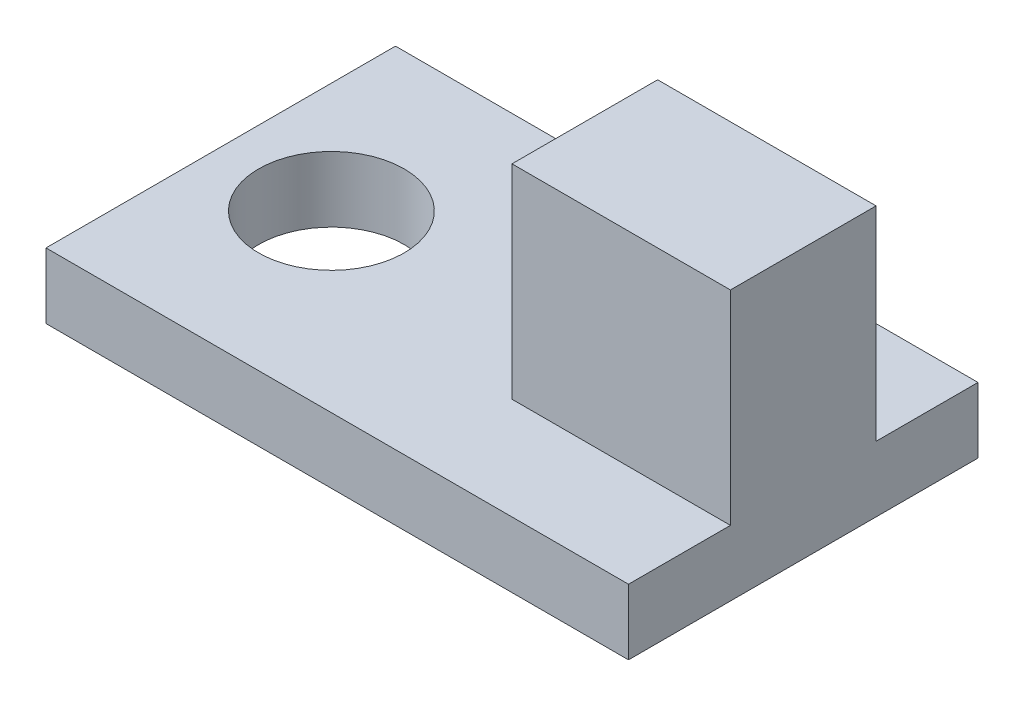
ISO-10303-21;
HEADER;
FILE_DESCRIPTION(('STEP AP214'),'2;1');
FILE_NAME('part.step','',(''),(''),'','','');
FILE_SCHEMA(('AUTOMOTIVE_DESIGN { 1 0 10303 214 1 1 1 1 }'));
ENDSEC;
DATA;
#1=APPLICATION_CONTEXT('core data for automotive mechanical design processes');
#2=APPLICATION_PROTOCOL_DEFINITION('international standard','automotive_design',2000,#1);
#3=PRODUCT_CONTEXT('',#1,'mechanical');
#4=PRODUCT('Part','Part','',(#3));
#5=PRODUCT_RELATED_PRODUCT_CATEGORY('part','',(#4));
#6=PRODUCT_DEFINITION_FORMATION('','',#4);
#7=PRODUCT_DEFINITION_CONTEXT('part definition',#1,'design');
#8=PRODUCT_DEFINITION('design','',#6,#7);
#9=PRODUCT_DEFINITION_SHAPE('','',#8);
#10=(LENGTH_UNIT() NAMED_UNIT(*) SI_UNIT(.MILLI.,.METRE.));
#11=(NAMED_UNIT(*) PLANE_ANGLE_UNIT() SI_UNIT($,.RADIAN.));
#12=(NAMED_UNIT(*) SI_UNIT($,.STERADIAN.) SOLID_ANGLE_UNIT());
#13=UNCERTAINTY_MEASURE_WITH_UNIT(LENGTH_MEASURE(1.E-05),#10,'distance_accuracy_value','');
#14=(GEOMETRIC_REPRESENTATION_CONTEXT(3) GLOBAL_UNCERTAINTY_ASSIGNED_CONTEXT((#13)) GLOBAL_UNIT_ASSIGNED_CONTEXT((#10,
#11,#12)) REPRESENTATION_CONTEXT('',''));
#15=CARTESIAN_POINT('',(0.,0.,0.));
#16=DIRECTION('',(0.,0.,1.));
#17=DIRECTION('',(1.,0.,0.));
#18=AXIS2_PLACEMENT_3D('',#15,#16,#17);
#19=CARTESIAN_POINT('',(56.1594146862626,-10.,14.989335089922));
#20=DIRECTION('',(0.,-1.,0.));
#21=DIRECTION('',(0.,0.,-1.));
#22=AXIS2_PLACEMENT_3D('',#19,#20,#21);
#23=PLANE('',#22);
#24=CARTESIAN_POINT('',(104.958650544286,-10.,14.989335089922));
#25=DIRECTION('',(0.,-1.,0.));
#26=DIRECTION('',(0.,0.,-1.));
#27=AXIS2_PLACEMENT_3D('',#24,#25,#26);
#28=CIRCLE('',#27,5.);
#29=CARTESIAN_POINT('',(104.958650544286,-10.,9.98933508992196));
#30=VERTEX_POINT('',#29);
#31=EDGE_CURVE('E11',#30,#30,#28,.T.);
#32=ORIENTED_EDGE('',*,*,#31,.T.);
#33=EDGE_LOOP('',(#32));
#34=FACE_BOUND('',#33,.T.);
#35=DIRECTION('',(1.,0.,0.));
#36=VECTOR('',#35,1.);
#37=CARTESIAN_POINT('',(137.360178828239,-10.,19.9893350899219));
#38=LINE('',#37,#36);
#39=CARTESIAN_POINT('',(122.360178828239,-10.,19.9893350899219));
#40=VERTEX_POINT('',#39);
#41=CARTESIAN_POINT('',(137.360178828239,-10.,19.9893350899219));
#42=VERTEX_POINT('',#41);
#43=EDGE_CURVE('E53',#40,#42,#38,.T.);
#44=ORIENTED_EDGE('',*,*,#43,.F.);
#45=DIRECTION('',(0.,0.,1.));
#46=VECTOR('',#45,1.);
#47=CARTESIAN_POINT('',(122.360178828239,-10.,9.98933508992193));
#48=LINE('',#47,#46);
#49=CARTESIAN_POINT('',(122.360178828239,-10.,9.98933508992193));
#50=VERTEX_POINT('',#49);
#51=EDGE_CURVE('E183',#50,#40,#48,.T.);
#52=ORIENTED_EDGE('',*,*,#51,.F.);
#53=DIRECTION('',(-1.,0.,0.));
#54=VECTOR('',#53,1.);
#55=CARTESIAN_POINT('',(137.360178828239,-10.,9.98933508992193));
#56=LINE('',#55,#54);
#57=CARTESIAN_POINT('',(137.360178828239,-10.,9.98933508992193));
#58=VERTEX_POINT('',#57);
#59=EDGE_CURVE('E59',#58,#50,#56,.T.);
#60=ORIENTED_EDGE('',*,*,#59,.F.);
#61=DIRECTION('',(0.,0.,-1.));
#62=VECTOR('',#61,1.);
#63=CARTESIAN_POINT('',(137.360178828239,-10.,14.989335089922));
#64=LINE('',#63,#62);
#65=CARTESIAN_POINT('',(137.360178828239,-10.,2.98933508992196));
#66=VERTEX_POINT('',#65);
#67=EDGE_CURVE('E129',#58,#66,#64,.T.);
#68=ORIENTED_EDGE('',*,*,#67,.T.);
#69=DIRECTION('',(1.,0.,0.));
#70=VECTOR('',#69,1.);
#71=CARTESIAN_POINT('',(97.3601788282394,-10.,2.98933508992196));
#72=LINE('',#71,#70);
#73=CARTESIAN_POINT('',(97.3601788282394,-10.,2.98933508992196));
#74=VERTEX_POINT('',#73);
#75=EDGE_CURVE('E150',#74,#66,#72,.T.);
#76=ORIENTED_EDGE('',*,*,#75,.F.);
#77=DIRECTION('',(0.,0.,-1.));
#78=VECTOR('',#77,1.);
#79=CARTESIAN_POINT('',(97.3601788282394,-10.,14.989335089922));
#80=LINE('',#79,#78);
#81=CARTESIAN_POINT('',(97.3601788282394,-10.,26.9893350899219));
#82=VERTEX_POINT('',#81);
#83=EDGE_CURVE('E40',#82,#74,#80,.T.);
#84=ORIENTED_EDGE('',*,*,#83,.F.);
#85=DIRECTION('',(-1.,0.,0.));
#86=VECTOR('',#85,1.);
#87=CARTESIAN_POINT('',(137.360178828239,-10.,26.9893350899219));
#88=LINE('',#87,#86);
#89=CARTESIAN_POINT('',(137.360178828239,-10.,26.9893350899219));
#90=VERTEX_POINT('',#89);
#91=EDGE_CURVE('E133',#90,#82,#88,.T.);
#92=ORIENTED_EDGE('',*,*,#91,.F.);
#93=EDGE_CURVE('E163',#90,#42,#64,.T.);
#94=ORIENTED_EDGE('',*,*,#93,.T.);
#95=EDGE_LOOP('',(#44,#52,#60,#68,#76,#84,#92,#94));
#96=FACE_BOUND('',#95,.T.);
#97=ADVANCED_FACE('F36',(#34,#96),#23,.F.);
#98=CARTESIAN_POINT('',(56.1594146862626,-14.5,14.989335089922));
#99=DIRECTION('',(0.,-1.,0.));
#100=DIRECTION('',(0.,0.,-1.));
#101=AXIS2_PLACEMENT_3D('',#98,#99,#100);
#102=PLANE('',#101);
#103=CARTESIAN_POINT('',(104.958650544286,-14.5,14.989335089922));
#104=DIRECTION('',(0.,-1.,0.));
#105=DIRECTION('',(0.,0.,-1.));
#106=AXIS2_PLACEMENT_3D('',#103,#104,#105);
#107=CIRCLE('',#106,5.);
#108=CARTESIAN_POINT('',(104.958650544286,-14.5,9.98933508992196));
#109=VERTEX_POINT('',#108);
#110=EDGE_CURVE('E45',#109,#109,#107,.T.);
#111=ORIENTED_EDGE('',*,*,#110,.F.);
#112=EDGE_LOOP('',(#111));
#113=FACE_BOUND('',#112,.T.);
#114=DIRECTION('',(0.,0.,-1.));
#115=VECTOR('',#114,1.);
#116=CARTESIAN_POINT('',(137.360178828239,-14.5,14.989335089922));
#117=LINE('',#116,#115);
#118=CARTESIAN_POINT('',(137.360178828239,-14.5,26.9893350899219));
#119=VERTEX_POINT('',#118);
#120=CARTESIAN_POINT('',(137.360178828239,-14.5,2.98933508992196));
#121=VERTEX_POINT('',#120);
#122=EDGE_CURVE('E162',#119,#121,#117,.T.);
#123=ORIENTED_EDGE('',*,*,#122,.F.);
#124=DIRECTION('',(1.,0.,0.));
#125=VECTOR('',#124,1.);
#126=CARTESIAN_POINT('',(97.3601788282394,-14.5,26.9893350899219));
#127=LINE('',#126,#125);
#128=CARTESIAN_POINT('',(97.3601788282394,-14.5,26.9893350899219));
#129=VERTEX_POINT('',#128);
#130=EDGE_CURVE('E144',#129,#119,#127,.T.);
#131=ORIENTED_EDGE('',*,*,#130,.F.);
#132=DIRECTION('',(0.,0.,-1.));
#133=VECTOR('',#132,1.);
#134=CARTESIAN_POINT('',(97.3601788282394,-14.5,14.989335089922));
#135=LINE('',#134,#133);
#136=CARTESIAN_POINT('',(97.3601788282394,-14.5,2.98933508992196));
#137=VERTEX_POINT('',#136);
#138=EDGE_CURVE('E159',#129,#137,#135,.T.);
#139=ORIENTED_EDGE('',*,*,#138,.T.);
#140=DIRECTION('',(-1.,0.,0.));
#141=VECTOR('',#140,1.);
#142=CARTESIAN_POINT('',(137.360178828239,-14.5,2.98933508992196));
#143=LINE('',#142,#141);
#144=EDGE_CURVE('E156',#121,#137,#143,.T.);
#145=ORIENTED_EDGE('',*,*,#144,.F.);
#146=EDGE_LOOP('',(#123,#131,#139,#145));
#147=FACE_BOUND('',#146,.T.);
#148=ADVANCED_FACE('F38',(#113,#147),#102,.T.);
#149=CARTESIAN_POINT('',(104.958650544286,-14.5,14.989335089922));
#150=DIRECTION('',(0.,1.,0.));
#151=DIRECTION('',(0.,0.,1.));
#152=AXIS2_PLACEMENT_3D('',#149,#150,#151);
#153=CYLINDRICAL_SURFACE('',#152,5.);
#154=ORIENTED_EDGE('',*,*,#31,.F.);
#155=EDGE_LOOP('',(#154));
#156=FACE_BOUND('',#155,.T.);
#157=ORIENTED_EDGE('',*,*,#110,.T.);
#158=EDGE_LOOP('',(#157));
#159=FACE_BOUND('',#158,.T.);
#160=ADVANCED_FACE('F206',(#156,#159),#153,.F.);
#161=CARTESIAN_POINT('',(137.360178828239,-14.5,14.989335089922));
#162=DIRECTION('',(1.,0.,0.));
#163=DIRECTION('',(0.,1.,0.));
#164=AXIS2_PLACEMENT_3D('',#161,#162,#163);
#165=PLANE('',#164);
#166=ORIENTED_EDGE('',*,*,#93,.F.);
#167=DIRECTION('',(0.,1.,0.));
#168=VECTOR('',#167,1.);
#169=CARTESIAN_POINT('',(137.360178828239,-14.5,26.9893350899219));
#170=LINE('',#169,#168);
#171=EDGE_CURVE('E130',#119,#90,#170,.T.);
#172=ORIENTED_EDGE('',*,*,#171,.F.);
#173=ORIENTED_EDGE('',*,*,#122,.T.);
#174=DIRECTION('',(0.,-1.,0.));
#175=VECTOR('',#174,1.);
#176=CARTESIAN_POINT('',(137.360178828239,-10.,2.98933508992196));
#177=LINE('',#176,#175);
#178=EDGE_CURVE('E153',#66,#121,#177,.T.);
#179=ORIENTED_EDGE('',*,*,#178,.F.);
#180=ORIENTED_EDGE('',*,*,#67,.F.);
#181=DIRECTION('',(0.,-1.,0.));
#182=VECTOR('',#181,1.);
#183=CARTESIAN_POINT('',(137.360178828239,4.,9.98933508992193));
#184=LINE('',#183,#182);
#185=CARTESIAN_POINT('',(137.360178828239,4.,9.98933508992193));
#186=VERTEX_POINT('',#185);
#187=EDGE_CURVE('E111',#186,#58,#184,.T.);
#188=ORIENTED_EDGE('',*,*,#187,.F.);
#189=DIRECTION('',(0.,0.,-1.));
#190=VECTOR('',#189,1.);
#191=CARTESIAN_POINT('',(137.360178828239,4.,9.98933508992193));
#192=LINE('',#191,#190);
#193=CARTESIAN_POINT('',(137.360178828239,4.,19.9893350899219));
#194=VERTEX_POINT('',#193);
#195=EDGE_CURVE('E117',#194,#186,#192,.T.);
#196=ORIENTED_EDGE('',*,*,#195,.F.);
#197=DIRECTION('',(0.,-1.,0.));
#198=VECTOR('',#197,1.);
#199=CARTESIAN_POINT('',(137.360178828239,4.,19.9893350899219));
#200=LINE('',#199,#198);
#201=EDGE_CURVE('E181',#194,#42,#200,.T.);
#202=ORIENTED_EDGE('',*,*,#201,.T.);
#203=EDGE_LOOP('',(#166,#172,#173,#179,#180,#188,#196,#202));
#204=FACE_BOUND('',#203,.T.);
#205=ADVANCED_FACE('F127',(#204),#165,.T.);
#206=CARTESIAN_POINT('',(97.3601788282394,-14.5,14.989335089922));
#207=DIRECTION('',(1.,0.,0.));
#208=DIRECTION('',(0.,1.,0.));
#209=AXIS2_PLACEMENT_3D('',#206,#207,#208);
#210=PLANE('',#209);
#211=ORIENTED_EDGE('',*,*,#83,.T.);
#212=DIRECTION('',(0.,1.,0.));
#213=VECTOR('',#212,1.);
#214=CARTESIAN_POINT('',(97.3601788282394,-14.5,2.98933508992196));
#215=LINE('',#214,#213);
#216=EDGE_CURVE('E147',#137,#74,#215,.T.);
#217=ORIENTED_EDGE('',*,*,#216,.F.);
#218=ORIENTED_EDGE('',*,*,#138,.F.);
#219=DIRECTION('',(0.,-1.,0.));
#220=VECTOR('',#219,1.);
#221=CARTESIAN_POINT('',(97.3601788282394,-10.,26.9893350899219));
#222=LINE('',#221,#220);
#223=EDGE_CURVE('E141',#82,#129,#222,.T.);
#224=ORIENTED_EDGE('',*,*,#223,.F.);
#225=EDGE_LOOP('',(#211,#217,#218,#224));
#226=FACE_BOUND('',#225,.T.);
#227=ADVANCED_FACE('F174',(#226),#210,.F.);
#228=CARTESIAN_POINT('',(0.,0.,2.98933508992196));
#229=DIRECTION('',(0.,0.,-1.));
#230=DIRECTION('',(-1.,0.,0.));
#231=AXIS2_PLACEMENT_3D('',#228,#229,#230);
#232=PLANE('',#231);
#233=ORIENTED_EDGE('',*,*,#216,.T.);
#234=ORIENTED_EDGE('',*,*,#75,.T.);
#235=ORIENTED_EDGE('',*,*,#178,.T.);
#236=ORIENTED_EDGE('',*,*,#144,.T.);
#237=EDGE_LOOP('',(#233,#234,#235,#236));
#238=FACE_BOUND('',#237,.T.);
#239=ADVANCED_FACE('F169',(#238),#232,.T.);
#240=CARTESIAN_POINT('',(0.,0.,26.9893350899219));
#241=DIRECTION('',(0.,0.,1.));
#242=DIRECTION('',(1.,0.,0.));
#243=AXIS2_PLACEMENT_3D('',#240,#241,#242);
#244=PLANE('',#243);
#245=ORIENTED_EDGE('',*,*,#171,.T.);
#246=ORIENTED_EDGE('',*,*,#91,.T.);
#247=ORIENTED_EDGE('',*,*,#223,.T.);
#248=ORIENTED_EDGE('',*,*,#130,.T.);
#249=EDGE_LOOP('',(#245,#246,#247,#248));
#250=FACE_BOUND('',#249,.T.);
#251=ADVANCED_FACE('F176',(#250),#244,.T.);
#252=CARTESIAN_POINT('',(137.360178828239,4.,9.98933508992193));
#253=DIRECTION('',(0.,0.,1.));
#254=DIRECTION('',(1.,0.,0.));
#255=AXIS2_PLACEMENT_3D('',#252,#253,#254);
#256=PLANE('',#255);
#257=ORIENTED_EDGE('',*,*,#59,.T.);
#258=DIRECTION('',(0.,-1.,0.));
#259=VECTOR('',#258,1.);
#260=CARTESIAN_POINT('',(122.360178828239,4.,9.98933508992193));
#261=LINE('',#260,#259);
#262=CARTESIAN_POINT('',(122.360178828239,4.,9.98933508992193));
#263=VERTEX_POINT('',#262);
#264=EDGE_CURVE('E113',#263,#50,#261,.T.);
#265=ORIENTED_EDGE('',*,*,#264,.F.);
#266=DIRECTION('',(-1.,0.,0.));
#267=VECTOR('',#266,1.);
#268=CARTESIAN_POINT('',(137.360178828239,4.,9.98933508992193));
#269=LINE('',#268,#267);
#270=EDGE_CURVE('E107',#186,#263,#269,.T.);
#271=ORIENTED_EDGE('',*,*,#270,.F.);
#272=ORIENTED_EDGE('',*,*,#187,.T.);
#273=EDGE_LOOP('',(#257,#265,#271,#272));
#274=FACE_BOUND('',#273,.T.);
#275=ADVANCED_FACE('F109',(#274),#256,.F.);
#276=CARTESIAN_POINT('',(122.360178828239,4.,9.98933508992193));
#277=DIRECTION('',(1.,0.,0.));
#278=DIRECTION('',(0.,0.,-1.));
#279=AXIS2_PLACEMENT_3D('',#276,#277,#278);
#280=PLANE('',#279);
#281=ORIENTED_EDGE('',*,*,#51,.T.);
#282=DIRECTION('',(0.,-1.,0.));
#283=VECTOR('',#282,1.);
#284=CARTESIAN_POINT('',(122.360178828239,4.,19.9893350899219));
#285=LINE('',#284,#283);
#286=CARTESIAN_POINT('',(122.360178828239,4.,19.9893350899219));
#287=VERTEX_POINT('',#286);
#288=EDGE_CURVE('E135',#287,#40,#285,.T.);
#289=ORIENTED_EDGE('',*,*,#288,.F.);
#290=DIRECTION('',(0.,0.,1.));
#291=VECTOR('',#290,1.);
#292=CARTESIAN_POINT('',(122.360178828239,4.,9.98933508992193));
#293=LINE('',#292,#291);
#294=EDGE_CURVE('E116',#263,#287,#293,.T.);
#295=ORIENTED_EDGE('',*,*,#294,.F.);
#296=ORIENTED_EDGE('',*,*,#264,.T.);
#297=EDGE_LOOP('',(#281,#289,#295,#296));
#298=FACE_BOUND('',#297,.T.);
#299=ADVANCED_FACE('F191',(#298),#280,.F.);
#300=CARTESIAN_POINT('',(137.360178828239,4.,19.9893350899219));
#301=DIRECTION('',(0.,0.,-1.));
#302=DIRECTION('',(-1.,0.,0.));
#303=AXIS2_PLACEMENT_3D('',#300,#301,#302);
#304=PLANE('',#303);
#305=ORIENTED_EDGE('',*,*,#43,.T.);
#306=ORIENTED_EDGE('',*,*,#201,.F.);
#307=DIRECTION('',(1.,0.,0.));
#308=VECTOR('',#307,1.);
#309=CARTESIAN_POINT('',(137.360178828239,4.,19.9893350899219));
#310=LINE('',#309,#308);
#311=EDGE_CURVE('E122',#287,#194,#310,.T.);
#312=ORIENTED_EDGE('',*,*,#311,.F.);
#313=ORIENTED_EDGE('',*,*,#288,.T.);
#314=EDGE_LOOP('',(#305,#306,#312,#313));
#315=FACE_BOUND('',#314,.T.);
#316=ADVANCED_FACE('F180',(#315),#304,.F.);
#317=CARTESIAN_POINT('',(0.,4.,0.));
#318=DIRECTION('',(0.,-1.,0.));
#319=DIRECTION('',(0.,0.,-1.));
#320=AXIS2_PLACEMENT_3D('',#317,#318,#319);
#321=PLANE('',#320);
#322=ORIENTED_EDGE('',*,*,#195,.T.);
#323=ORIENTED_EDGE('',*,*,#270,.T.);
#324=ORIENTED_EDGE('',*,*,#294,.T.);
#325=ORIENTED_EDGE('',*,*,#311,.T.);
#326=EDGE_LOOP('',(#322,#323,#324,#325));
#327=FACE_BOUND('',#326,.T.);
#328=ADVANCED_FACE('F120',(#327),#321,.F.);
#329=CLOSED_SHELL('',(#97,#148,#160,#205,#227,#239,#251,#275,#299,#316,#328));
#330=MANIFOLD_SOLID_BREP('B2',#329);
#331=ADVANCED_BREP_SHAPE_REPRESENTATION('',(#18,#330),#14);
#332=SHAPE_DEFINITION_REPRESENTATION(#9,#331);
ENDSEC;
END-ISO-10303-21;
